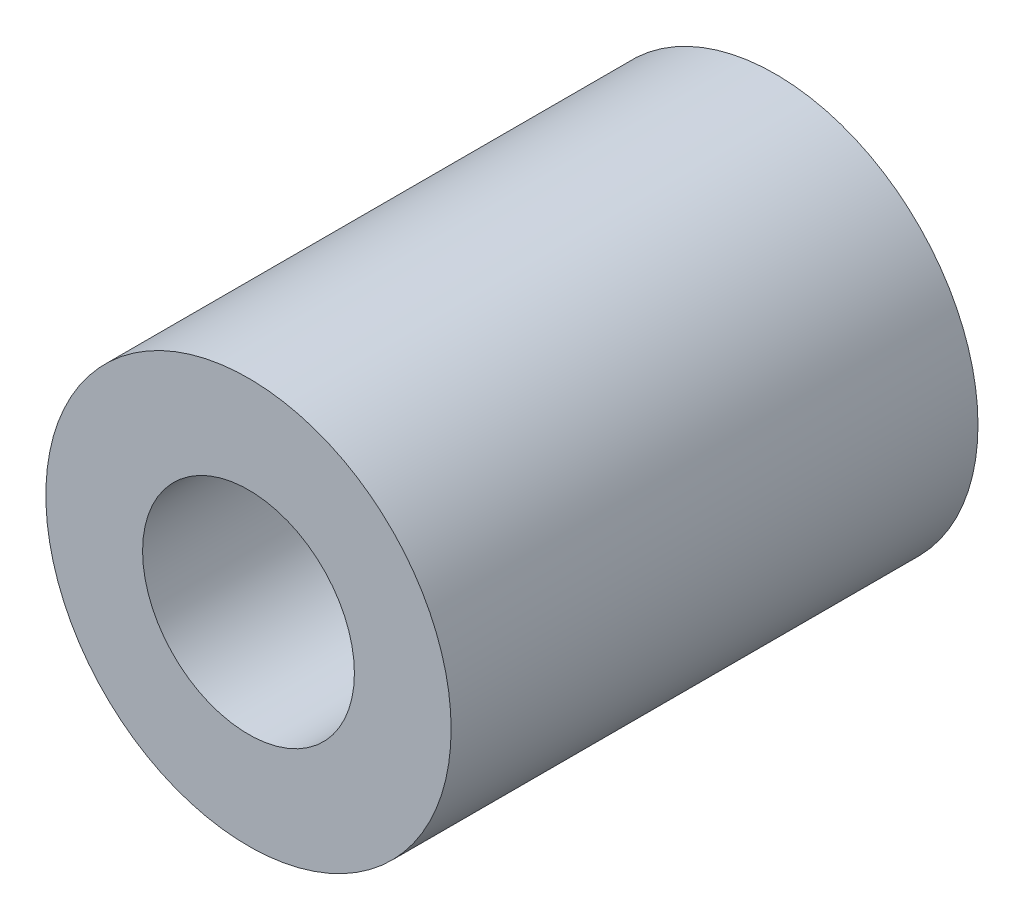
ISO-10303-21;
HEADER;
FILE_DESCRIPTION(('STEP AP214'),'2;1');
FILE_NAME('part.step','',(''),(''),'','','');
FILE_SCHEMA(('AUTOMOTIVE_DESIGN { 1 0 10303 214 1 1 1 1 }'));
ENDSEC;
DATA;
#1=APPLICATION_CONTEXT('core data for automotive mechanical design processes');
#2=APPLICATION_PROTOCOL_DEFINITION('international standard','automotive_design',2000,#1);
#3=PRODUCT_CONTEXT('',#1,'mechanical');
#4=PRODUCT('Part','Part','',(#3));
#5=PRODUCT_RELATED_PRODUCT_CATEGORY('part','',(#4));
#6=PRODUCT_DEFINITION_FORMATION('','',#4);
#7=PRODUCT_DEFINITION_CONTEXT('part definition',#1,'design');
#8=PRODUCT_DEFINITION('design','',#6,#7);
#9=PRODUCT_DEFINITION_SHAPE('','',#8);
#10=(LENGTH_UNIT() NAMED_UNIT(*) SI_UNIT(.MILLI.,.METRE.));
#11=(NAMED_UNIT(*) PLANE_ANGLE_UNIT() SI_UNIT($,.RADIAN.));
#12=(NAMED_UNIT(*) SI_UNIT($,.STERADIAN.) SOLID_ANGLE_UNIT());
#13=UNCERTAINTY_MEASURE_WITH_UNIT(LENGTH_MEASURE(1.E-05),#10,'distance_accuracy_value','');
#14=(GEOMETRIC_REPRESENTATION_CONTEXT(3) GLOBAL_UNCERTAINTY_ASSIGNED_CONTEXT((#13)) GLOBAL_UNIT_ASSIGNED_CONTEXT((#10,
#11,#12)) REPRESENTATION_CONTEXT('',''));
#15=CARTESIAN_POINT('',(0.,0.,0.));
#16=DIRECTION('',(0.,0.,1.));
#17=DIRECTION('',(1.,0.,0.));
#18=AXIS2_PLACEMENT_3D('',#15,#16,#17);
#19=CARTESIAN_POINT('',(0.,0.,6.19125));
#20=DIRECTION('',(0.,0.,1.));
#21=DIRECTION('',(1.,0.,0.));
#22=AXIS2_PLACEMENT_3D('',#19,#20,#21);
#23=PLANE('',#22);
#24=CARTESIAN_POINT('',(0.,0.,6.19125));
#25=DIRECTION('',(0.,0.,1.));
#26=DIRECTION('',(1.,0.,0.));
#27=AXIS2_PLACEMENT_3D('',#24,#25,#26);
#28=CIRCLE('',#27,4.7625);
#29=CARTESIAN_POINT('',(4.7625,0.,6.19125));
#30=VERTEX_POINT('',#29);
#31=EDGE_CURVE('E10',#30,#30,#28,.T.);
#32=ORIENTED_EDGE('',*,*,#31,.T.);
#33=EDGE_LOOP('',(#32));
#34=FACE_BOUND('',#33,.T.);
#35=CARTESIAN_POINT('',(0.,0.,6.19125));
#36=DIRECTION('',(0.,0.,1.));
#37=DIRECTION('',(1.,0.,0.));
#38=AXIS2_PLACEMENT_3D('',#35,#36,#37);
#39=CIRCLE('',#38,2.4892);
#40=CARTESIAN_POINT('',(2.4892,0.,6.19125));
#41=VERTEX_POINT('',#40);
#42=EDGE_CURVE('E50',#41,#41,#39,.T.);
#43=ORIENTED_EDGE('',*,*,#42,.F.);
#44=EDGE_LOOP('',(#43));
#45=FACE_BOUND('',#44,.T.);
#46=ADVANCED_FACE('F39',(#34,#45),#23,.T.);
#47=CARTESIAN_POINT('',(0.,0.,-6.19125));
#48=DIRECTION('',(0.,0.,1.));
#49=DIRECTION('',(1.,0.,0.));
#50=AXIS2_PLACEMENT_3D('',#47,#48,#49);
#51=PLANE('',#50);
#52=CARTESIAN_POINT('',(0.,0.,-6.19125));
#53=DIRECTION('',(0.,0.,1.));
#54=DIRECTION('',(1.,0.,0.));
#55=AXIS2_PLACEMENT_3D('',#52,#53,#54);
#56=CIRCLE('',#55,4.7625);
#57=CARTESIAN_POINT('',(4.7625,0.,-6.19125));
#58=VERTEX_POINT('',#57);
#59=EDGE_CURVE('E43',#58,#58,#56,.T.);
#60=ORIENTED_EDGE('',*,*,#59,.F.);
#61=EDGE_LOOP('',(#60));
#62=FACE_BOUND('',#61,.T.);
#63=CARTESIAN_POINT('',(0.,0.,-6.19125));
#64=DIRECTION('',(0.,0.,1.));
#65=DIRECTION('',(1.,0.,0.));
#66=AXIS2_PLACEMENT_3D('',#63,#64,#65);
#67=CIRCLE('',#66,2.4892);
#68=CARTESIAN_POINT('',(2.4892,0.,-6.19125));
#69=VERTEX_POINT('',#68);
#70=EDGE_CURVE('E52',#69,#69,#67,.T.);
#71=ORIENTED_EDGE('',*,*,#70,.T.);
#72=EDGE_LOOP('',(#71));
#73=FACE_BOUND('',#72,.T.);
#74=ADVANCED_FACE('F62',(#62,#73),#51,.F.);
#75=CARTESIAN_POINT('',(0.,0.,6.19125));
#76=DIRECTION('',(0.,0.,-1.));
#77=DIRECTION('',(-1.,0.,0.));
#78=AXIS2_PLACEMENT_3D('',#75,#76,#77);
#79=CYLINDRICAL_SURFACE('',#78,4.7625);
#80=ORIENTED_EDGE('',*,*,#31,.F.);
#81=EDGE_LOOP('',(#80));
#82=FACE_BOUND('',#81,.T.);
#83=ORIENTED_EDGE('',*,*,#59,.T.);
#84=EDGE_LOOP('',(#83));
#85=FACE_BOUND('',#84,.T.);
#86=ADVANCED_FACE('F41',(#82,#85),#79,.T.);
#87=CARTESIAN_POINT('',(0.,0.,6.19125));
#88=DIRECTION('',(0.,0.,-1.));
#89=DIRECTION('',(-1.,0.,0.));
#90=AXIS2_PLACEMENT_3D('',#87,#88,#89);
#91=CYLINDRICAL_SURFACE('',#90,2.4892);
#92=ORIENTED_EDGE('',*,*,#42,.T.);
#93=EDGE_LOOP('',(#92));
#94=FACE_BOUND('',#93,.T.);
#95=ORIENTED_EDGE('',*,*,#70,.F.);
#96=EDGE_LOOP('',(#95));
#97=FACE_BOUND('',#96,.T.);
#98=ADVANCED_FACE('F58',(#94,#97),#91,.F.);
#99=CLOSED_SHELL('',(#46,#74,#86,#98));
#100=MANIFOLD_SOLID_BREP('B2',#99);
#101=ADVANCED_BREP_SHAPE_REPRESENTATION('',(#18,#100),#14);
#102=SHAPE_DEFINITION_REPRESENTATION(#9,#101);
ENDSEC;
END-ISO-10303-21;
